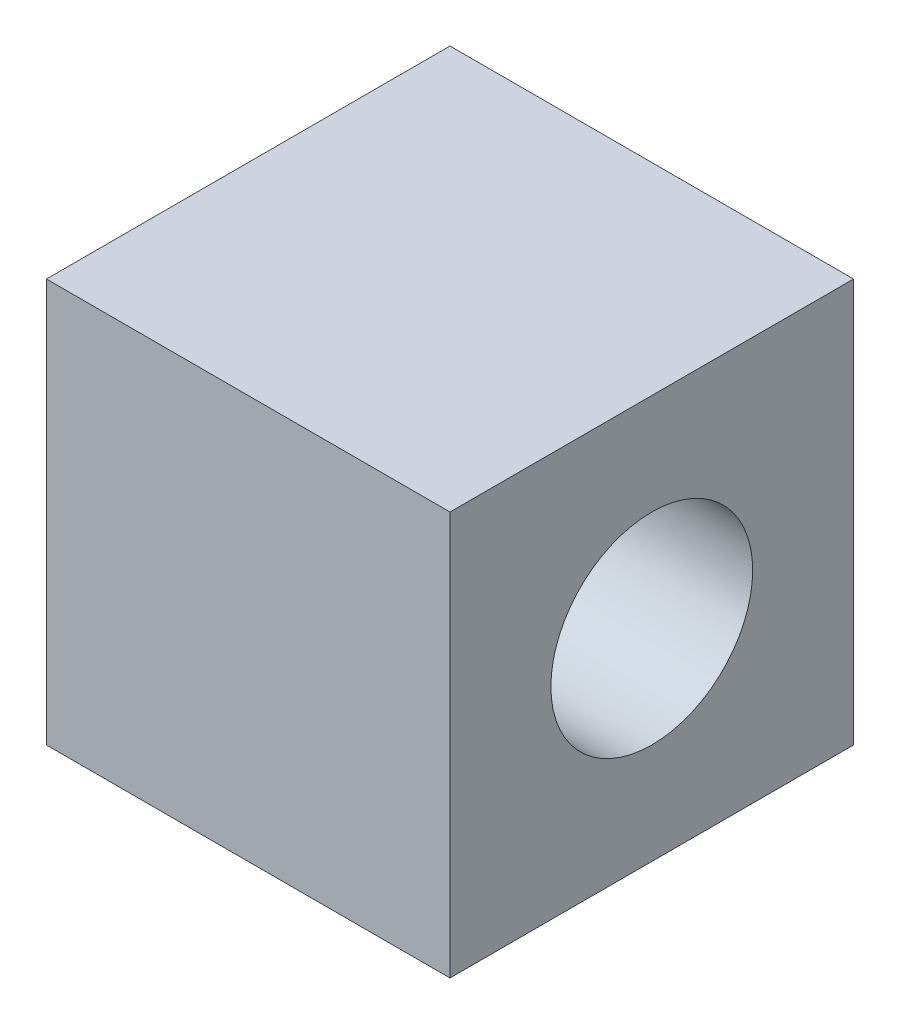
ISO-10303-21;
HEADER;
FILE_DESCRIPTION(('STEP AP214'),'2;1');
FILE_NAME('part.step','',(''),(''),'','','');
FILE_SCHEMA(('AUTOMOTIVE_DESIGN { 1 0 10303 214 1 1 1 1 }'));
ENDSEC;
DATA;
#1=APPLICATION_CONTEXT('core data for automotive mechanical design processes');
#2=APPLICATION_PROTOCOL_DEFINITION('international standard','automotive_design',2000,#1);
#3=PRODUCT_CONTEXT('',#1,'mechanical');
#4=PRODUCT('Part','Part','',(#3));
#5=PRODUCT_RELATED_PRODUCT_CATEGORY('part','',(#4));
#6=PRODUCT_DEFINITION_FORMATION('','',#4);
#7=PRODUCT_DEFINITION_CONTEXT('part definition',#1,'design');
#8=PRODUCT_DEFINITION('design','',#6,#7);
#9=PRODUCT_DEFINITION_SHAPE('','',#8);
#10=(LENGTH_UNIT() NAMED_UNIT(*) SI_UNIT(.MILLI.,.METRE.));
#11=(NAMED_UNIT(*) PLANE_ANGLE_UNIT() SI_UNIT($,.RADIAN.));
#12=(NAMED_UNIT(*) SI_UNIT($,.STERADIAN.) SOLID_ANGLE_UNIT());
#13=UNCERTAINTY_MEASURE_WITH_UNIT(LENGTH_MEASURE(1.E-05),#10,'distance_accuracy_value','');
#14=(GEOMETRIC_REPRESENTATION_CONTEXT(3) GLOBAL_UNCERTAINTY_ASSIGNED_CONTEXT((#13)) GLOBAL_UNIT_ASSIGNED_CONTEXT((#10,
#11,#12)) REPRESENTATION_CONTEXT('',''));
#15=CARTESIAN_POINT('',(0.,0.,0.));
#16=DIRECTION('',(0.,0.,1.));
#17=DIRECTION('',(1.,0.,0.));
#18=AXIS2_PLACEMENT_3D('',#15,#16,#17);
#19=CARTESIAN_POINT('',(25.4,-25.4,50.8));
#20=DIRECTION('',(-1.,0.,0.));
#21=DIRECTION('',(0.,0.,1.));
#22=AXIS2_PLACEMENT_3D('',#19,#20,#21);
#23=PLANE('',#22);
#24=CARTESIAN_POINT('',(25.4,0.,25.4));
#25=DIRECTION('',(1.,0.,0.));
#26=DIRECTION('',(0.,0.,-1.));
#27=AXIS2_PLACEMENT_3D('',#24,#25,#26);
#28=CIRCLE('',#27,12.7);
#29=CARTESIAN_POINT('',(25.4,0.,12.7));
#30=VERTEX_POINT('',#29);
#31=EDGE_CURVE('E116',#30,#30,#28,.T.);
#32=ORIENTED_EDGE('',*,*,#31,.F.);
#33=EDGE_LOOP('',(#32));
#34=FACE_BOUND('',#33,.T.);
#35=DIRECTION('',(0.,1.,0.));
#36=VECTOR('',#35,1.);
#37=CARTESIAN_POINT('',(25.4,-25.4,0.));
#38=LINE('',#37,#36);
#39=CARTESIAN_POINT('',(25.4,-25.4,0.));
#40=VERTEX_POINT('',#39);
#41=CARTESIAN_POINT('',(25.4,25.4,0.));
#42=VERTEX_POINT('',#41);
#43=EDGE_CURVE('E102',#40,#42,#38,.T.);
#44=ORIENTED_EDGE('',*,*,#43,.T.);
#45=DIRECTION('',(0.,0.,-1.));
#46=VECTOR('',#45,1.);
#47=CARTESIAN_POINT('',(25.4,25.4,50.8));
#48=LINE('',#47,#46);
#49=CARTESIAN_POINT('',(25.4,25.4,50.8));
#50=VERTEX_POINT('',#49);
#51=EDGE_CURVE('E11',#50,#42,#48,.T.);
#52=ORIENTED_EDGE('',*,*,#51,.F.);
#53=DIRECTION('',(0.,1.,0.));
#54=VECTOR('',#53,1.);
#55=CARTESIAN_POINT('',(25.4,-25.4,50.8));
#56=LINE('',#55,#54);
#57=CARTESIAN_POINT('',(25.4,-25.4,50.8));
#58=VERTEX_POINT('',#57);
#59=EDGE_CURVE('E90',#58,#50,#56,.T.);
#60=ORIENTED_EDGE('',*,*,#59,.F.);
#61=DIRECTION('',(0.,0.,-1.));
#62=VECTOR('',#61,1.);
#63=CARTESIAN_POINT('',(25.4,-25.4,50.8));
#64=LINE('',#63,#62);
#65=EDGE_CURVE('E98',#58,#40,#64,.T.);
#66=ORIENTED_EDGE('',*,*,#65,.T.);
#67=EDGE_LOOP('',(#44,#52,#60,#66));
#68=FACE_BOUND('',#67,.T.);
#69=ADVANCED_FACE('F39',(#34,#68),#23,.F.);
#70=CARTESIAN_POINT('',(-25.4,25.4,50.8));
#71=DIRECTION('',(0.,-1.,0.));
#72=DIRECTION('',(0.,0.,-1.));
#73=AXIS2_PLACEMENT_3D('',#70,#71,#72);
#74=PLANE('',#73);
#75=DIRECTION('',(-1.,0.,0.));
#76=VECTOR('',#75,1.);
#77=CARTESIAN_POINT('',(-25.4,25.4,0.));
#78=LINE('',#77,#76);
#79=CARTESIAN_POINT('',(-25.4,25.4,0.));
#80=VERTEX_POINT('',#79);
#81=EDGE_CURVE('E94',#42,#80,#78,.T.);
#82=ORIENTED_EDGE('',*,*,#81,.T.);
#83=DIRECTION('',(0.,0.,-1.));
#84=VECTOR('',#83,1.);
#85=CARTESIAN_POINT('',(-25.4,25.4,50.8));
#86=LINE('',#85,#84);
#87=CARTESIAN_POINT('',(-25.4,25.4,50.8));
#88=VERTEX_POINT('',#87);
#89=EDGE_CURVE('E47',#88,#80,#86,.T.);
#90=ORIENTED_EDGE('',*,*,#89,.F.);
#91=DIRECTION('',(-1.,0.,0.));
#92=VECTOR('',#91,1.);
#93=CARTESIAN_POINT('',(-25.4,25.4,50.8));
#94=LINE('',#93,#92);
#95=EDGE_CURVE('E85',#50,#88,#94,.T.);
#96=ORIENTED_EDGE('',*,*,#95,.F.);
#97=ORIENTED_EDGE('',*,*,#51,.T.);
#98=EDGE_LOOP('',(#82,#90,#96,#97));
#99=FACE_BOUND('',#98,.T.);
#100=ADVANCED_FACE('F93',(#99),#74,.F.);
#101=CARTESIAN_POINT('',(-25.4,-25.4,50.8));
#102=DIRECTION('',(1.,0.,0.));
#103=DIRECTION('',(0.,0.,-1.));
#104=AXIS2_PLACEMENT_3D('',#101,#102,#103);
#105=PLANE('',#104);
#106=CARTESIAN_POINT('',(-25.4,0.,25.4));
#107=DIRECTION('',(1.,0.,0.));
#108=DIRECTION('',(0.,0.,-1.));
#109=AXIS2_PLACEMENT_3D('',#106,#107,#108);
#110=CIRCLE('',#109,12.7);
#111=CARTESIAN_POINT('',(-25.4,0.,12.7));
#112=VERTEX_POINT('',#111);
#113=EDGE_CURVE('E105',#112,#112,#110,.T.);
#114=ORIENTED_EDGE('',*,*,#113,.T.);
#115=EDGE_LOOP('',(#114));
#116=FACE_BOUND('',#115,.T.);
#117=DIRECTION('',(0.,-1.,0.));
#118=VECTOR('',#117,1.);
#119=CARTESIAN_POINT('',(-25.4,-25.4,0.));
#120=LINE('',#119,#118);
#121=CARTESIAN_POINT('',(-25.4,-25.4,0.));
#122=VERTEX_POINT('',#121);
#123=EDGE_CURVE('E72',#80,#122,#120,.T.);
#124=ORIENTED_EDGE('',*,*,#123,.T.);
#125=DIRECTION('',(0.,0.,-1.));
#126=VECTOR('',#125,1.);
#127=CARTESIAN_POINT('',(-25.4,-25.4,50.8));
#128=LINE('',#127,#126);
#129=CARTESIAN_POINT('',(-25.4,-25.4,50.8));
#130=VERTEX_POINT('',#129);
#131=EDGE_CURVE('E95',#130,#122,#128,.T.);
#132=ORIENTED_EDGE('',*,*,#131,.F.);
#133=DIRECTION('',(0.,-1.,0.));
#134=VECTOR('',#133,1.);
#135=CARTESIAN_POINT('',(-25.4,-25.4,50.8));
#136=LINE('',#135,#134);
#137=EDGE_CURVE('E88',#88,#130,#136,.T.);
#138=ORIENTED_EDGE('',*,*,#137,.F.);
#139=ORIENTED_EDGE('',*,*,#89,.T.);
#140=EDGE_LOOP('',(#124,#132,#138,#139));
#141=FACE_BOUND('',#140,.T.);
#142=ADVANCED_FACE('F96',(#116,#141),#105,.F.);
#143=CARTESIAN_POINT('',(-25.4,-25.4,50.8));
#144=DIRECTION('',(0.,1.,0.));
#145=DIRECTION('',(0.,0.,1.));
#146=AXIS2_PLACEMENT_3D('',#143,#144,#145);
#147=PLANE('',#146);
#148=DIRECTION('',(1.,0.,0.));
#149=VECTOR('',#148,1.);
#150=CARTESIAN_POINT('',(-25.4,-25.4,0.));
#151=LINE('',#150,#149);
#152=EDGE_CURVE('E78',#122,#40,#151,.T.);
#153=ORIENTED_EDGE('',*,*,#152,.T.);
#154=ORIENTED_EDGE('',*,*,#65,.F.);
#155=DIRECTION('',(1.,0.,0.));
#156=VECTOR('',#155,1.);
#157=CARTESIAN_POINT('',(-25.4,-25.4,50.8));
#158=LINE('',#157,#156);
#159=EDGE_CURVE('E55',#130,#58,#158,.T.);
#160=ORIENTED_EDGE('',*,*,#159,.F.);
#161=ORIENTED_EDGE('',*,*,#131,.T.);
#162=EDGE_LOOP('',(#153,#154,#160,#161));
#163=FACE_BOUND('',#162,.T.);
#164=ADVANCED_FACE('F110',(#163),#147,.F.);
#165=CARTESIAN_POINT('',(0.,0.,50.8));
#166=DIRECTION('',(0.,0.,-1.));
#167=DIRECTION('',(-1.,0.,0.));
#168=AXIS2_PLACEMENT_3D('',#165,#166,#167);
#169=PLANE('',#168);
#170=ORIENTED_EDGE('',*,*,#59,.T.);
#171=ORIENTED_EDGE('',*,*,#95,.T.);
#172=ORIENTED_EDGE('',*,*,#137,.T.);
#173=ORIENTED_EDGE('',*,*,#159,.T.);
#174=EDGE_LOOP('',(#170,#171,#172,#173));
#175=FACE_BOUND('',#174,.T.);
#176=ADVANCED_FACE('F86',(#175),#169,.F.);
#177=CARTESIAN_POINT('',(0.,0.,0.));
#178=DIRECTION('',(0.,0.,-1.));
#179=DIRECTION('',(-1.,0.,0.));
#180=AXIS2_PLACEMENT_3D('',#177,#178,#179);
#181=PLANE('',#180);
#182=ORIENTED_EDGE('',*,*,#43,.F.);
#183=ORIENTED_EDGE('',*,*,#152,.F.);
#184=ORIENTED_EDGE('',*,*,#123,.F.);
#185=ORIENTED_EDGE('',*,*,#81,.F.);
#186=EDGE_LOOP('',(#182,#183,#184,#185));
#187=FACE_BOUND('',#186,.T.);
#188=ADVANCED_FACE('F113',(#187),#181,.T.);
#189=CARTESIAN_POINT('',(-25.4,0.,25.4));
#190=DIRECTION('',(1.,0.,0.));
#191=DIRECTION('',(0.,0.,-1.));
#192=AXIS2_PLACEMENT_3D('',#189,#190,#191);
#193=CYLINDRICAL_SURFACE('',#192,12.7);
#194=ORIENTED_EDGE('',*,*,#113,.F.);
#195=EDGE_LOOP('',(#194));
#196=FACE_BOUND('',#195,.T.);
#197=ORIENTED_EDGE('',*,*,#31,.T.);
#198=EDGE_LOOP('',(#197));
#199=FACE_BOUND('',#198,.T.);
#200=ADVANCED_FACE('F123',(#196,#199),#193,.F.);
#201=CLOSED_SHELL('',(#69,#100,#142,#164,#176,#188,#200));
#202=MANIFOLD_SOLID_BREP('B2',#201);
#203=ADVANCED_BREP_SHAPE_REPRESENTATION('',(#18,#202),#14);
#204=SHAPE_DEFINITION_REPRESENTATION(#9,#203);
ENDSEC;
END-ISO-10303-21;
